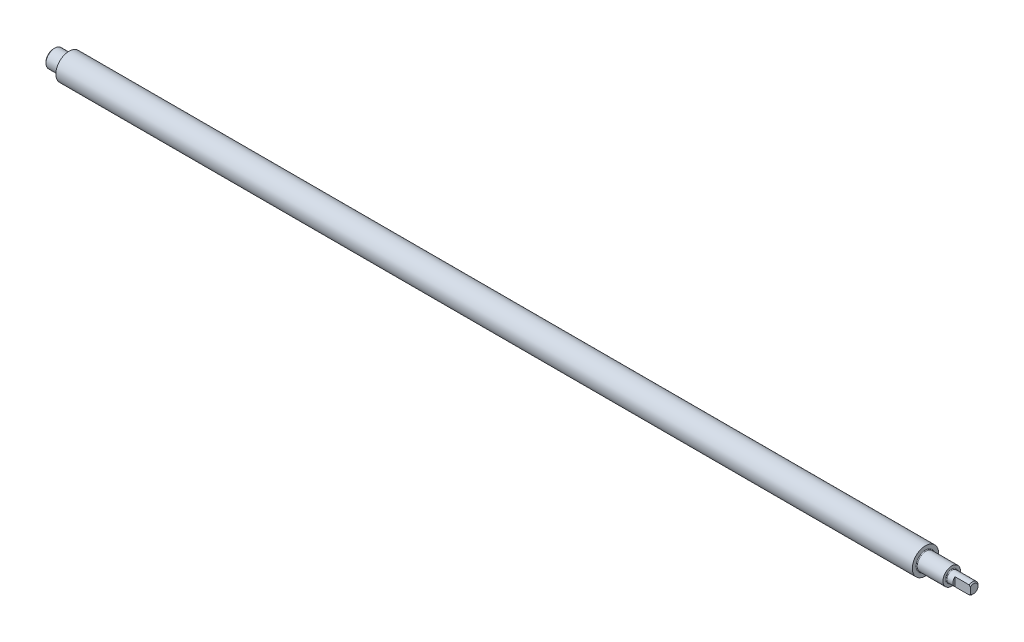
ISO-10303-21;
HEADER;
FILE_DESCRIPTION(('STEP AP214'),'2;1');
FILE_NAME('part.step','',(''),(''),'','','');
FILE_SCHEMA(('AUTOMOTIVE_DESIGN { 1 0 10303 214 1 1 1 1 }'));
ENDSEC;
DATA;
#1=APPLICATION_CONTEXT('core data for automotive mechanical design processes');
#2=APPLICATION_PROTOCOL_DEFINITION('international standard','automotive_design',2000,#1);
#3=PRODUCT_CONTEXT('',#1,'mechanical');
#4=PRODUCT('Part','Part','',(#3));
#5=PRODUCT_RELATED_PRODUCT_CATEGORY('part','',(#4));
#6=PRODUCT_DEFINITION_FORMATION('','',#4);
#7=PRODUCT_DEFINITION_CONTEXT('part definition',#1,'design');
#8=PRODUCT_DEFINITION('design','',#6,#7);
#9=PRODUCT_DEFINITION_SHAPE('','',#8);
#10=(LENGTH_UNIT() NAMED_UNIT(*) SI_UNIT(.MILLI.,.METRE.));
#11=(NAMED_UNIT(*) PLANE_ANGLE_UNIT() SI_UNIT($,.RADIAN.));
#12=(NAMED_UNIT(*) SI_UNIT($,.STERADIAN.) SOLID_ANGLE_UNIT());
#13=UNCERTAINTY_MEASURE_WITH_UNIT(LENGTH_MEASURE(1.E-05),#10,'distance_accuracy_value','');
#14=(GEOMETRIC_REPRESENTATION_CONTEXT(3) GLOBAL_UNCERTAINTY_ASSIGNED_CONTEXT((#13)) GLOBAL_UNIT_ASSIGNED_CONTEXT((#10,
#11,#12)) REPRESENTATION_CONTEXT('',''));
#15=CARTESIAN_POINT('',(0.,0.,0.));
#16=DIRECTION('',(0.,0.,1.));
#17=DIRECTION('',(1.,0.,0.));
#18=AXIS2_PLACEMENT_3D('',#15,#16,#17);
#19=CARTESIAN_POINT('',(398.,6.,0.));
#20=DIRECTION('',(-1.,0.,0.));
#21=DIRECTION('',(0.,0.,1.));
#22=AXIS2_PLACEMENT_3D('',#19,#20,#21);
#23=PLANE('',#22);
#24=CARTESIAN_POINT('',(398.00000000001,0.,0.));
#25=DIRECTION('',(1.,0.,0.));
#26=DIRECTION('',(0.,0.,-1.));
#27=AXIS2_PLACEMENT_3D('',#24,#25,#26);
#28=CIRCLE('',#27,6.00000000001);
#29=CARTESIAN_POINT('',(398.00000000001,0.,-6.00000000001));
#30=VERTEX_POINT('',#29);
#31=EDGE_CURVE('E11',#30,#30,#28,.T.);
#32=ORIENTED_EDGE('',*,*,#31,.T.);
#33=EDGE_LOOP('',(#32));
#34=FACE_BOUND('',#33,.T.);
#35=CARTESIAN_POINT('',(398.00000000001,0.,0.));
#36=DIRECTION('',(1.,0.,0.));
#37=DIRECTION('',(0.,0.,-1.));
#38=AXIS2_PLACEMENT_3D('',#35,#36,#37);
#39=CIRCLE('',#38,4.30000000001);
#40=CARTESIAN_POINT('',(398.00000000001,0.,-4.30000000001));
#41=VERTEX_POINT('',#40);
#42=EDGE_CURVE('E97',#41,#41,#39,.T.);
#43=ORIENTED_EDGE('',*,*,#42,.F.);
#44=EDGE_LOOP('',(#43));
#45=FACE_BOUND('',#44,.T.);
#46=ADVANCED_FACE('F17',(#34,#45),#23,.F.);
#47=CARTESIAN_POINT('',(7.,0.,0.));
#48=DIRECTION('',(1.,0.,0.));
#49=DIRECTION('',(0.,1.,0.));
#50=AXIS2_PLACEMENT_3D('',#47,#48,#49);
#51=PLANE('',#50);
#52=CARTESIAN_POINT('',(7.00000000001001,0.,0.));
#53=DIRECTION('',(1.,0.,0.));
#54=DIRECTION('',(0.,0.,-1.));
#55=AXIS2_PLACEMENT_3D('',#52,#53,#54);
#56=CIRCLE('',#55,6.00000000001);
#57=CARTESIAN_POINT('',(7.00000000001001,0.,-6.00000000001));
#58=VERTEX_POINT('',#57);
#59=EDGE_CURVE('E177',#58,#58,#56,.T.);
#60=ORIENTED_EDGE('',*,*,#59,.F.);
#61=EDGE_LOOP('',(#60));
#62=FACE_BOUND('',#61,.T.);
#63=CARTESIAN_POINT('',(7.00000000001,0.,0.));
#64=DIRECTION('',(1.,0.,0.));
#65=DIRECTION('',(0.,0.,-1.));
#66=AXIS2_PLACEMENT_3D('',#63,#64,#65);
#67=CIRCLE('',#66,4.30000000001);
#68=CARTESIAN_POINT('',(7.00000000001,0.,-4.30000000001));
#69=VERTEX_POINT('',#68);
#70=EDGE_CURVE('E27',#69,#69,#67,.T.);
#71=ORIENTED_EDGE('',*,*,#70,.T.);
#72=EDGE_LOOP('',(#71));
#73=FACE_BOUND('',#72,.T.);
#74=ADVANCED_FACE('F131',(#62,#73),#51,.F.);
#75=CARTESIAN_POINT('',(413.,-6.,1.5));
#76=DIRECTION('',(0.,0.,-1.));
#77=DIRECTION('',(0.,-1.,0.));
#78=AXIS2_PLACEMENT_3D('',#75,#76,#77);
#79=PLANE('',#78);
#80=DIRECTION('',(0.,1.,0.));
#81=VECTOR('',#80,1.);
#82=CARTESIAN_POINT('',(413.00000000001,-6.00000000001,1.50000000001));
#83=LINE('',#82,#81);
#84=CARTESIAN_POINT('',(413.,-2.,1.5));
#85=VERTEX_POINT('',#84);
#86=CARTESIAN_POINT('',(413.,2.,1.5));
#87=VERTEX_POINT('',#86);
#88=EDGE_CURVE('E42',#85,#87,#83,.T.);
#89=ORIENTED_EDGE('',*,*,#88,.F.);
#90=DIRECTION('',(-1.,0.,0.));
#91=VECTOR('',#90,1.);
#92=CARTESIAN_POINT('',(420.00000000001,-2.00000000001,1.50000000001));
#93=LINE('',#92,#91);
#94=CARTESIAN_POINT('',(419.5,-2.,1.5));
#95=VERTEX_POINT('',#94);
#96=EDGE_CURVE('E85',#95,#85,#93,.T.);
#97=ORIENTED_EDGE('',*,*,#96,.F.);
#98=CARTESIAN_POINT('',(419.999999999998,-1.32287565553426,1.50000000000093));
#99=CARTESIAN_POINT('',(419.982687171982,-1.34904719434911,1.50000068070888));
#100=CARTESIAN_POINT('',(419.96517242674,-1.37508423455457,1.50000779295262));
#101=CARTESIAN_POINT('',(419.929203954791,-1.42775937337219,1.50002778959488));
#102=CARTESIAN_POINT('',(419.910738249463,-1.45438929757547,1.50004085507939));
#103=CARTESIAN_POINT('',(419.872868753631,-1.5082674469492,1.50006501900582));
#104=CARTESIAN_POINT('',(419.853453919428,-1.53550789790912,1.50007604037666));
#105=CARTESIAN_POINT('',(419.81368478393,-1.59062071967949,1.50009182913516));
#106=CARTESIAN_POINT('',(419.793320228097,-1.61848568572849,1.50009638679708));
#107=CARTESIAN_POINT('',(419.75165101589,-1.6748589450981,1.50009738969478));
#108=CARTESIAN_POINT('',(419.730336847216,-1.70336020139042,1.50009357750921));
#109=CARTESIAN_POINT('',(419.686767577697,-1.7610151109786,1.50007906166694));
#110=CARTESIAN_POINT('',(419.664503630492,-1.79016207497596,1.50006815091313));
#111=CARTESIAN_POINT('',(419.619034416072,-1.84911569108985,1.50004368424203));
#112=CARTESIAN_POINT('',(419.595820915609,-1.87891598791732,1.50003005894769));
#113=CARTESIAN_POINT('',(419.548450988346,-1.93918109151928,1.50000831496581));
#114=CARTESIAN_POINT('',(419.524286843548,-1.96963983400448,1.5000003690341));
#115=CARTESIAN_POINT('',(419.499999999998,-2.00000000000041,1.50000000000279));
#116=B_SPLINE_CURVE_WITH_KNOTS('',3,(#98,#99,#100,#101,#102,#103,#104,#105,#106,#107,#108,#109,
#110,#111,#112,#113,#114,#115),.UNSPECIFIED.,.F.,.F.,(4,2,2,2,2,2,2,2,4),(0.,0.0941369387688887,
0.191351118929671,0.291702014928128,0.39523979575331,0.502006439355485,0.612036737612699,
0.725359204169925,0.841996897853126),.UNSPECIFIED.);
#117=CARTESIAN_POINT('',(420.,-1.3228756555323,1.5));
#118=VERTEX_POINT('',#117);
#119=EDGE_CURVE('E114',#118,#95,#116,.T.);
#120=ORIENTED_EDGE('',*,*,#119,.F.);
#121=DIRECTION('',(0.,1.,0.));
#122=VECTOR('',#121,1.);
#123=CARTESIAN_POINT('',(420.00000000001,-6.00000000001,1.50000000001));
#124=LINE('',#123,#122);
#125=CARTESIAN_POINT('',(420.,1.3228756555323,1.5));
#126=VERTEX_POINT('',#125);
#127=EDGE_CURVE('E164',#118,#126,#124,.T.);
#128=ORIENTED_EDGE('',*,*,#127,.T.);
#129=CARTESIAN_POINT('',(419.499999999998,2.00000000000053,1.50000000000272));
#130=CARTESIAN_POINT('',(419.524286843548,1.96963983400463,1.50000036903403));
#131=CARTESIAN_POINT('',(419.548450988346,1.93918109151948,1.50000831496573));
#132=CARTESIAN_POINT('',(419.595820915609,1.87891598791761,1.50003005894762));
#133=CARTESIAN_POINT('',(419.619034416072,1.84911569109017,1.50004368424195));
#134=CARTESIAN_POINT('',(419.664503630492,1.79016207497632,1.50006815091307));
#135=CARTESIAN_POINT('',(419.686767577697,1.76101511097898,1.50007906166688));
#136=CARTESIAN_POINT('',(419.730336847216,1.70336020139081,1.50009357750916));
#137=CARTESIAN_POINT('',(419.75165101589,1.67485894509849,1.50009738969474));
#138=CARTESIAN_POINT('',(419.793320228096,1.61848568572888,1.50009638679706));
#139=CARTESIAN_POINT('',(419.81368478393,1.59062071967987,1.50009182913515));
#140=CARTESIAN_POINT('',(419.853453919428,1.53550789790947,1.50007604037666));
#141=CARTESIAN_POINT('',(419.87286875363,1.50826744694952,1.50006501900583));
#142=CARTESIAN_POINT('',(419.910738249463,1.45438929757573,1.5000408550794));
#143=CARTESIAN_POINT('',(419.929203954791,1.42775937337242,1.5000277895949));
#144=CARTESIAN_POINT('',(419.965172426739,1.37508423455472,1.50000779295264));
#145=CARTESIAN_POINT('',(419.982687171982,1.34904719434921,1.50000068070891));
#146=CARTESIAN_POINT('',(419.999999999998,1.32287565553432,1.50000000000095));
#147=B_SPLINE_CURVE_WITH_KNOTS('',3,(#129,#130,#131,#132,#133,#134,#135,#136,#137,#138,#139,
#140,#141,#142,#143,#144,#145,#146),.UNSPECIFIED.,.F.,.F.,(4,2,2,2,2,2,2,2,4),(0.,
0.116637693683028,0.229960160240148,0.339990458497289,0.446757102099458,0.550294882924697,
0.65064577892321,0.74785995908411,0.841996897853176),.UNSPECIFIED.);
#148=CARTESIAN_POINT('',(419.5,2.00000000000024,1.5));
#149=VERTEX_POINT('',#148);
#150=EDGE_CURVE('E61',#149,#126,#147,.T.);
#151=ORIENTED_EDGE('',*,*,#150,.F.);
#152=DIRECTION('',(1.,0.,0.));
#153=VECTOR('',#152,1.);
#154=CARTESIAN_POINT('',(420.00000000001,2.00000000001,1.50000000001));
#155=LINE('',#154,#153);
#156=EDGE_CURVE('E74',#87,#149,#155,.T.);
#157=ORIENTED_EDGE('',*,*,#156,.F.);
#158=EDGE_LOOP('',(#89,#97,#120,#128,#151,#157));
#159=FACE_BOUND('',#158,.T.);
#160=ADVANCED_FACE('F83',(#159),#79,.F.);
#161=CARTESIAN_POINT('',(419.5,0.,0.));
#162=DIRECTION('',(-1.,0.,0.));
#163=DIRECTION('',(0.,0.,1.));
#164=AXIS2_PLACEMENT_3D('',#161,#162,#163);
#165=CONICAL_SURFACE('',#164,2.5,0.785398163397448);
#166=CARTESIAN_POINT('',(420.00000000001,0.,0.));
#167=DIRECTION('',(1.,0.,0.));
#168=DIRECTION('',(0.,0.,-1.));
#169=AXIS2_PLACEMENT_3D('',#166,#167,#168);
#170=CIRCLE('',#169,2.00000000001);
#171=EDGE_CURVE('E173',#118,#126,#170,.T.);
#172=ORIENTED_EDGE('',*,*,#171,.F.);
#173=ORIENTED_EDGE('',*,*,#119,.T.);
#174=CARTESIAN_POINT('',(419.50000000001,0.,0.));
#175=DIRECTION('',(1.,0.,0.));
#176=DIRECTION('',(0.,0.,-1.));
#177=AXIS2_PLACEMENT_3D('',#174,#175,#176);
#178=CIRCLE('',#177,2.50000000001);
#179=EDGE_CURVE('E183',#95,#149,#178,.T.);
#180=ORIENTED_EDGE('',*,*,#179,.T.);
#181=ORIENTED_EDGE('',*,*,#150,.T.);
#182=EDGE_LOOP('',(#172,#173,#180,#181));
#183=FACE_BOUND('',#182,.T.);
#184=ADVANCED_FACE('F120',(#183),#165,.T.);
#185=CARTESIAN_POINT('',(420.,2.,0.));
#186=DIRECTION('',(-1.,0.,0.));
#187=DIRECTION('',(0.,0.,1.));
#188=AXIS2_PLACEMENT_3D('',#185,#186,#187);
#189=PLANE('',#188);
#190=ORIENTED_EDGE('',*,*,#171,.T.);
#191=ORIENTED_EDGE('',*,*,#127,.F.);
#192=EDGE_LOOP('',(#190,#191));
#193=FACE_BOUND('',#192,.T.);
#194=ADVANCED_FACE('F130',(#193),#189,.F.);
#195=CARTESIAN_POINT('',(398.,0.,0.));
#196=DIRECTION('',(-1.,0.,0.));
#197=DIRECTION('',(0.,0.,-1.));
#198=AXIS2_PLACEMENT_3D('',#195,#196,#197);
#199=CYLINDRICAL_SURFACE('',#198,6.);
#200=ORIENTED_EDGE('',*,*,#59,.T.);
#201=EDGE_LOOP('',(#200));
#202=FACE_BOUND('',#201,.T.);
#203=ORIENTED_EDGE('',*,*,#31,.F.);
#204=EDGE_LOOP('',(#203));
#205=FACE_BOUND('',#204,.T.);
#206=ADVANCED_FACE('F158',(#202,#205),#199,.T.);
#207=CARTESIAN_POINT('',(6.7,0.,0.));
#208=DIRECTION('',(1.,0.,0.));
#209=DIRECTION('',(0.,0.,-1.));
#210=AXIS2_PLACEMENT_3D('',#207,#208,#209);
#211=TOROIDAL_SURFACE('',#210,4.3,0.3);
#212=CARTESIAN_POINT('',(6.70000000001,0.,0.));
#213=DIRECTION('',(1.,0.,0.));
#214=DIRECTION('',(0.,0.,-1.));
#215=AXIS2_PLACEMENT_3D('',#212,#213,#214);
#216=CIRCLE('',#215,4.00000000001);
#217=CARTESIAN_POINT('',(6.70000000001,0.,-4.00000000001));
#218=VERTEX_POINT('',#217);
#219=EDGE_CURVE('E95',#218,#218,#216,.T.);
#220=ORIENTED_EDGE('',*,*,#219,.T.);
#221=EDGE_LOOP('',(#220));
#222=FACE_BOUND('',#221,.T.);
#223=ORIENTED_EDGE('',*,*,#70,.F.);
#224=EDGE_LOOP('',(#223));
#225=FACE_BOUND('',#224,.T.);
#226=ADVANCED_FACE('F303',(#222,#225),#211,.F.);
#227=CARTESIAN_POINT('',(398.3,0.,0.));
#228=DIRECTION('',(1.,0.,0.));
#229=DIRECTION('',(0.,0.,-1.));
#230=AXIS2_PLACEMENT_3D('',#227,#228,#229);
#231=TOROIDAL_SURFACE('',#230,4.29999999999989,0.299999999999856);
#232=ORIENTED_EDGE('',*,*,#42,.T.);
#233=EDGE_LOOP('',(#232));
#234=FACE_BOUND('',#233,.T.);
#235=CARTESIAN_POINT('',(398.30000000001,0.,0.));
#236=DIRECTION('',(1.,0.,0.));
#237=DIRECTION('',(0.,0.,-1.));
#238=AXIS2_PLACEMENT_3D('',#235,#236,#237);
#239=CIRCLE('',#238,4.00000000001003);
#240=CARTESIAN_POINT('',(398.30000000001,0.,-4.00000000001003));
#241=VERTEX_POINT('',#240);
#242=EDGE_CURVE('E232',#241,#241,#239,.T.);
#243=ORIENTED_EDGE('',*,*,#242,.F.);
#244=EDGE_LOOP('',(#243));
#245=FACE_BOUND('',#244,.T.);
#246=ADVANCED_FACE('F310',(#234,#245),#231,.F.);
#247=CARTESIAN_POINT('',(7.,0.,0.));
#248=DIRECTION('',(-1.,0.,0.));
#249=DIRECTION('',(0.,0.,-1.));
#250=AXIS2_PLACEMENT_3D('',#247,#248,#249);
#251=CYLINDRICAL_SURFACE('',#250,4.);
#252=CARTESIAN_POINT('',(0.50000000001,0.,0.));
#253=DIRECTION('',(1.,0.,0.));
#254=DIRECTION('',(0.,0.,-1.));
#255=AXIS2_PLACEMENT_3D('',#252,#253,#254);
#256=CIRCLE('',#255,4.00000000001);
#257=CARTESIAN_POINT('',(0.50000000001,0.,-4.00000000001));
#258=VERTEX_POINT('',#257);
#259=EDGE_CURVE('E101',#258,#258,#256,.T.);
#260=ORIENTED_EDGE('',*,*,#259,.T.);
#261=EDGE_LOOP('',(#260));
#262=FACE_BOUND('',#261,.T.);
#263=ORIENTED_EDGE('',*,*,#219,.F.);
#264=EDGE_LOOP('',(#263));
#265=FACE_BOUND('',#264,.T.);
#266=ADVANCED_FACE('F318',(#262,#265),#251,.T.);
#267=CARTESIAN_POINT('',(0.,0.,0.));
#268=DIRECTION('',(1.,0.,0.));
#269=DIRECTION('',(0.,0.,-1.));
#270=AXIS2_PLACEMENT_3D('',#267,#268,#269);
#271=CONICAL_SURFACE('',#270,3.5,0.785398163397449);
#272=ORIENTED_EDGE('',*,*,#259,.F.);
#273=EDGE_LOOP('',(#272));
#274=FACE_BOUND('',#273,.T.);
#275=CARTESIAN_POINT('',(0.,0.,0.));
#276=DIRECTION('',(1.,0.,0.));
#277=DIRECTION('',(0.,0.,-1.));
#278=AXIS2_PLACEMENT_3D('',#275,#276,#277);
#279=CIRCLE('',#278,3.50000000001);
#280=CARTESIAN_POINT('',(0.,0.,-3.50000000001));
#281=VERTEX_POINT('',#280);
#282=EDGE_CURVE('E105',#281,#281,#279,.T.);
#283=ORIENTED_EDGE('',*,*,#282,.T.);
#284=EDGE_LOOP('',(#283));
#285=FACE_BOUND('',#284,.T.);
#286=ADVANCED_FACE('F325',(#274,#285),#271,.T.);
#287=CARTESIAN_POINT('',(0.,0.,0.));
#288=DIRECTION('',(1.,0.,0.));
#289=DIRECTION('',(0.,1.,0.));
#290=AXIS2_PLACEMENT_3D('',#287,#288,#289);
#291=PLANE('',#290);
#292=ORIENTED_EDGE('',*,*,#282,.F.);
#293=EDGE_LOOP('',(#292));
#294=FACE_BOUND('',#293,.T.);
#295=ADVANCED_FACE('F157',(#294),#291,.F.);
#296=CARTESIAN_POINT('',(420.,0.,0.));
#297=DIRECTION('',(-1.,0.,0.));
#298=DIRECTION('',(0.,0.,-1.));
#299=AXIS2_PLACEMENT_3D('',#296,#297,#298);
#300=CYLINDRICAL_SURFACE('',#299,4.);
#301=ORIENTED_EDGE('',*,*,#242,.T.);
#302=EDGE_LOOP('',(#301));
#303=FACE_BOUND('',#302,.T.);
#304=CARTESIAN_POINT('',(410.00000000001,0.,0.));
#305=DIRECTION('',(1.,0.,0.));
#306=DIRECTION('',(0.,0.,-1.));
#307=AXIS2_PLACEMENT_3D('',#304,#305,#306);
#308=CIRCLE('',#307,4.00000000001);
#309=CARTESIAN_POINT('',(410.00000000001,0.,-4.00000000001));
#310=VERTEX_POINT('',#309);
#311=EDGE_CURVE('E109',#310,#310,#308,.T.);
#312=ORIENTED_EDGE('',*,*,#311,.F.);
#313=EDGE_LOOP('',(#312));
#314=FACE_BOUND('',#313,.T.);
#315=ADVANCED_FACE('F340',(#303,#314),#300,.T.);
#316=CARTESIAN_POINT('',(410.,4.,0.));
#317=DIRECTION('',(-1.,0.,0.));
#318=DIRECTION('',(0.,0.,1.));
#319=AXIS2_PLACEMENT_3D('',#316,#317,#318);
#320=PLANE('',#319);
#321=ORIENTED_EDGE('',*,*,#311,.T.);
#322=EDGE_LOOP('',(#321));
#323=FACE_BOUND('',#322,.T.);
#324=CARTESIAN_POINT('',(410.00000000001,0.,0.));
#325=DIRECTION('',(1.,0.,0.));
#326=DIRECTION('',(0.,0.,-1.));
#327=AXIS2_PLACEMENT_3D('',#324,#325,#326);
#328=CIRCLE('',#327,2.80000000000995);
#329=CARTESIAN_POINT('',(410.00000000001,0.,-2.80000000000995));
#330=VERTEX_POINT('',#329);
#331=EDGE_CURVE('E106',#330,#330,#328,.T.);
#332=ORIENTED_EDGE('',*,*,#331,.F.);
#333=EDGE_LOOP('',(#332));
#334=FACE_BOUND('',#333,.T.);
#335=ADVANCED_FACE('F133',(#323,#334),#320,.F.);
#336=CARTESIAN_POINT('',(410.3,0.,0.));
#337=DIRECTION('',(1.,0.,0.));
#338=DIRECTION('',(0.,0.,-1.));
#339=AXIS2_PLACEMENT_3D('',#336,#337,#338);
#340=TOROIDAL_SURFACE('',#339,2.8,0.300000000000022);
#341=ORIENTED_EDGE('',*,*,#331,.T.);
#342=EDGE_LOOP('',(#341));
#343=FACE_BOUND('',#342,.T.);
#344=CARTESIAN_POINT('',(410.30000000001,0.,0.));
#345=DIRECTION('',(1.,0.,0.));
#346=DIRECTION('',(0.,0.,-1.));
#347=AXIS2_PLACEMENT_3D('',#344,#345,#346);
#348=CIRCLE('',#347,2.50000000000999);
#349=CARTESIAN_POINT('',(410.30000000001,0.,-2.50000000000999));
#350=VERTEX_POINT('',#349);
#351=EDGE_CURVE('E110',#350,#350,#348,.T.);
#352=ORIENTED_EDGE('',*,*,#351,.F.);
#353=EDGE_LOOP('',(#352));
#354=FACE_BOUND('',#353,.T.);
#355=ADVANCED_FACE('F353',(#343,#354),#340,.F.);
#356=CARTESIAN_POINT('',(420.,0.,0.));
#357=DIRECTION('',(-1.,0.,0.));
#358=DIRECTION('',(0.,0.,-1.));
#359=AXIS2_PLACEMENT_3D('',#356,#357,#358);
#360=CYLINDRICAL_SURFACE('',#359,2.5);
#361=ORIENTED_EDGE('',*,*,#351,.T.);
#362=EDGE_LOOP('',(#361));
#363=FACE_BOUND('',#362,.T.);
#364=ORIENTED_EDGE('',*,*,#179,.F.);
#365=ORIENTED_EDGE('',*,*,#96,.T.);
#366=CARTESIAN_POINT('',(413.00000000001,0.,0.));
#367=DIRECTION('',(1.,0.,0.));
#368=DIRECTION('',(0.,0.,-1.));
#369=AXIS2_PLACEMENT_3D('',#366,#367,#368);
#370=CIRCLE('',#369,2.50000000001);
#371=EDGE_CURVE('E81',#87,#85,#370,.T.);
#372=ORIENTED_EDGE('',*,*,#371,.F.);
#373=ORIENTED_EDGE('',*,*,#156,.T.);
#374=EDGE_LOOP('',(#364,#365,#372,#373));
#375=FACE_BOUND('',#374,.T.);
#376=ADVANCED_FACE('F86',(#363,#375),#360,.T.);
#377=CARTESIAN_POINT('',(413.,0.,0.));
#378=DIRECTION('',(1.,0.,0.));
#379=DIRECTION('',(0.,1.,0.));
#380=AXIS2_PLACEMENT_3D('',#377,#378,#379);
#381=PLANE('',#380);
#382=ORIENTED_EDGE('',*,*,#88,.T.);
#383=ORIENTED_EDGE('',*,*,#371,.T.);
#384=EDGE_LOOP('',(#382,#383));
#385=FACE_BOUND('',#384,.T.);
#386=ADVANCED_FACE('F80',(#385),#381,.T.);
#387=CLOSED_SHELL('',(#46,#74,#160,#184,#194,#206,#226,#246,#266,#286,#295,#315,#335,#355,#376,#386));
#388=MANIFOLD_SOLID_BREP('B1',#387);
#389=ADVANCED_BREP_SHAPE_REPRESENTATION('',(#18,#388),#14);
#390=SHAPE_DEFINITION_REPRESENTATION(#9,#389);
ENDSEC;
END-ISO-10303-21;
